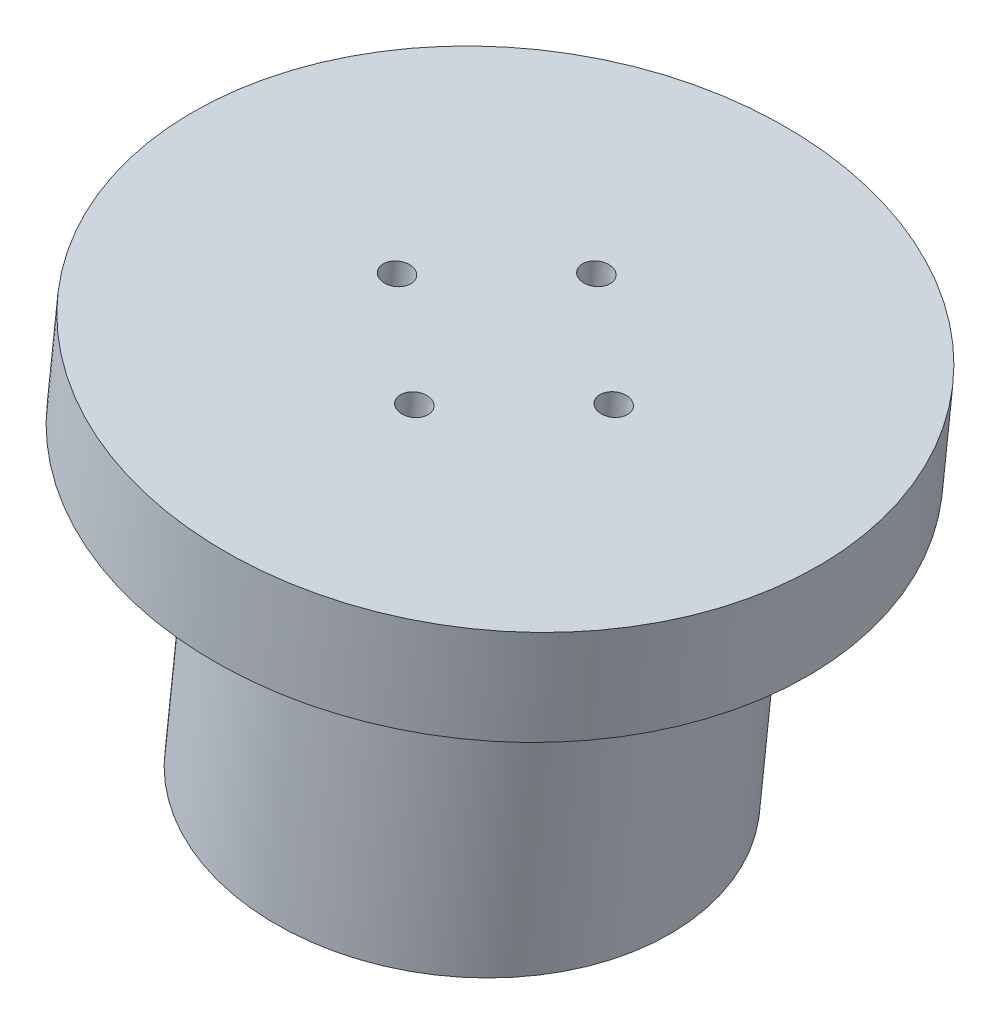
ISO-10303-21;
HEADER;
FILE_DESCRIPTION(('STEP AP214'),'2;1');
FILE_NAME('part.step','',(''),(''),'','','');
FILE_SCHEMA(('AUTOMOTIVE_DESIGN { 1 0 10303 214 1 1 1 1 }'));
ENDSEC;
DATA;
#1=APPLICATION_CONTEXT('core data for automotive mechanical design processes');
#2=APPLICATION_PROTOCOL_DEFINITION('international standard','automotive_design',2000,#1);
#3=PRODUCT_CONTEXT('',#1,'mechanical');
#4=PRODUCT('Part','Part','',(#3));
#5=PRODUCT_RELATED_PRODUCT_CATEGORY('part','',(#4));
#6=PRODUCT_DEFINITION_FORMATION('','',#4);
#7=PRODUCT_DEFINITION_CONTEXT('part definition',#1,'design');
#8=PRODUCT_DEFINITION('design','',#6,#7);
#9=PRODUCT_DEFINITION_SHAPE('','',#8);
#10=(LENGTH_UNIT() NAMED_UNIT(*) SI_UNIT(.MILLI.,.METRE.));
#11=(NAMED_UNIT(*) PLANE_ANGLE_UNIT() SI_UNIT($,.RADIAN.));
#12=(NAMED_UNIT(*) SI_UNIT($,.STERADIAN.) SOLID_ANGLE_UNIT());
#13=UNCERTAINTY_MEASURE_WITH_UNIT(LENGTH_MEASURE(1.E-05),#10,'distance_accuracy_value','');
#14=(GEOMETRIC_REPRESENTATION_CONTEXT(3) GLOBAL_UNCERTAINTY_ASSIGNED_CONTEXT((#13)) GLOBAL_UNIT_ASSIGNED_CONTEXT((#10,
#11,#12)) REPRESENTATION_CONTEXT('',''));
#15=CARTESIAN_POINT('',(0.,0.,0.));
#16=DIRECTION('',(0.,0.,1.));
#17=DIRECTION('',(1.,0.,0.));
#18=AXIS2_PLACEMENT_3D('',#15,#16,#17);
#19=CARTESIAN_POINT('',(7.83250383480386,445.546548210172,8.65719315332694));
#20=DIRECTION('',(0.116648657415178,0.993096529839059,0.0123439517519945));
#21=DIRECTION('',(0.133769325424471,-0.0280256039483678,0.99061613811749));
#22=AXIS2_PLACEMENT_3D('',#19,#20,#21);
#23=PLANE('',#22);
#24=CARTESIAN_POINT('',(11.4562528553722,444.746221265878,38.8012232444906));
#25=DIRECTION('',(0.116648657415178,0.993096529839059,0.0123439517519945));
#26=DIRECTION('',(-0.99317219910734,0.116657545492306,0.));
#27=AXIS2_PLACEMENT_3D('',#24,#25,#26);
#28=CIRCLE('',#27,1.36499999999957);
#29=CARTESIAN_POINT('',(10.1005728035911,444.905458815475,38.8012232444905));
#30=VERTEX_POINT('',#29);
#31=EDGE_CURVE('E142',#30,#30,#28,.F.);
#32=ORIENTED_EDGE('',*,*,#31,.F.);
#33=EDGE_LOOP('',(#32));
#34=FACE_BOUND('',#33,.T.);
#35=CARTESIAN_POINT('',(0.914724071024655,446.094423300402,29.9515789486514));
#36=DIRECTION('',(0.116648657415178,0.993096529839059,0.0123439517519945));
#37=DIRECTION('',(-0.99317219910734,0.116657545492306,0.));
#38=AXIS2_PLACEMENT_3D('',#35,#36,#37);
#39=CIRCLE('',#38,1.36499999999956);
#40=CARTESIAN_POINT('',(-0.440955980756431,446.253660849999,29.9515789486514));
#41=VERTEX_POINT('',#40);
#42=EDGE_CURVE('E150',#41,#41,#39,.F.);
#43=ORIENTED_EDGE('',*,*,#42,.F.);
#44=EDGE_LOOP('',(#43));
#45=FACE_BOUND('',#44,.T.);
#46=CARTESIAN_POINT('',(9.71991725239853,445.192248297397,19.3255573364657));
#47=DIRECTION('',(0.116648657415178,0.993096529839059,0.0123439517519945));
#48=DIRECTION('',(-0.99317219910734,0.116657545492306,0.));
#49=AXIS2_PLACEMENT_3D('',#46,#47,#48);
#50=CIRCLE('',#49,1.365);
#51=CARTESIAN_POINT('',(8.36423720061702,445.351485846994,19.3255573364657));
#52=VERTEX_POINT('',#51);
#53=EDGE_CURVE('E156',#52,#52,#50,.F.);
#54=ORIENTED_EDGE('',*,*,#53,.F.);
#55=EDGE_LOOP('',(#54));
#56=FACE_BOUND('',#55,.T.);
#57=CARTESIAN_POINT('',(20.2614460367461,443.844046262872,28.1752016323049));
#58=DIRECTION('',(0.116648657415178,0.993096529839059,0.0123439517519945));
#59=DIRECTION('',(-0.99317219910734,0.116657545492306,0.));
#60=AXIS2_PLACEMENT_3D('',#57,#58,#59);
#61=CIRCLE('',#60,1.36499999999999);
#62=CARTESIAN_POINT('',(18.9057659849646,444.00328381247,28.1752016323048));
#63=VERTEX_POINT('',#62);
#64=EDGE_CURVE('E162',#63,#63,#61,.F.);
#65=ORIENTED_EDGE('',*,*,#64,.F.);
#66=EDGE_LOOP('',(#65));
#67=FACE_BOUND('',#66,.T.);
#68=CARTESIAN_POINT('',(10.5880850538852,444.969234781637,29.0633902904782));
#69=DIRECTION('',(0.116648657415178,0.993096529839059,0.0123439517519945));
#70=DIRECTION('',(-0.99317219910734,0.116657545492306,0.));
#71=AXIS2_PLACEMENT_3D('',#68,#69,#70);
#72=CIRCLE('',#71,20.5994999988178);
#73=CARTESIAN_POINT('',(-9.87076566045233,447.372321889868,29.0633902904782));
#74=VERTEX_POINT('',#73);
#75=EDGE_CURVE('E11',#74,#74,#72,.T.);
#76=ORIENTED_EDGE('',*,*,#75,.F.);
#77=EDGE_LOOP('',(#76));
#78=FACE_BOUND('',#77,.T.);
#79=DIRECTION('',(-0.762244246598037,0.0974867369922966,-0.639906278011698));
#80=VECTOR('',#79,1.);
#81=CARTESIAN_POINT('',(13.4438543253917,444.644483562369,28.203670270111));
#82=LINE('',#81,#80);
#83=CARTESIAN_POINT('',(13.4438543253449,444.644483562333,28.2036702701231));
#84=VERTEX_POINT('',#83);
#85=CARTESIAN_POINT('',(10.9157761608135,444.967810491008,26.0813412449968));
#86=VERTEX_POINT('',#85);
#87=EDGE_CURVE('E54',#84,#86,#82,.T.);
#88=ORIENTED_EDGE('',*,*,#87,.T.);
#89=CARTESIAN_POINT('',(10.5880850538712,444.969234781684,29.0633902904626));
#90=DIRECTION('',(-0.116648657417233,-0.993096529838796,-0.01234395175372));
#91=DIRECTION('',(0.993172199107099,-0.116657545494363,0.));
#92=AXIS2_PLACEMENT_3D('',#89,#90,#91);
#93=CIRCLE('',#92,2.99999999995608);
#94=EDGE_CURVE('E73',#84,#86,#93,.T.);
#95=ORIENTED_EDGE('',*,*,#94,.F.);
#96=EDGE_LOOP('',(#88,#95));
#97=FACE_BOUND('',#96,.T.);
#98=ADVANCED_FACE('F39',(#34,#45,#56,#67,#78,#97),#23,.F.);
#99=CARTESIAN_POINT('',(3.79164615028357,387.107275288299,28.3441800073878));
#100=DIRECTION('',(0.116648657417233,0.993096529838796,0.0123439517537201));
#101=DIRECTION('',(-0.993172199107099,0.116657545494364,0.));
#102=AXIS2_PLACEMENT_3D('',#99,#100,#101);
#103=CYLINDRICAL_SURFACE('',#102,20.5994999988178);
#104=ORIENTED_EDGE('',*,*,#75,.T.);
#105=EDGE_LOOP('',(#104));
#106=FACE_BOUND('',#105,.T.);
#107=CARTESIAN_POINT('',(14.1283718064982,475.109714462245,29.4380292262036));
#108=DIRECTION('',(-0.116648657415178,-0.993096529839059,-0.0123439517519948));
#109=DIRECTION('',(0.993172199107341,-0.116657545492306,0.));
#110=AXIS2_PLACEMENT_3D('',#107,#108,#109);
#111=CIRCLE('',#110,20.5994999988178);
#112=CARTESIAN_POINT('',(34.5872225208358,472.706627354014,29.4380292262036));
#113=VERTEX_POINT('',#112);
#114=EDGE_CURVE('E47',#113,#113,#111,.F.);
#115=ORIENTED_EDGE('',*,*,#114,.F.);
#116=EDGE_LOOP('',(#115));
#117=FACE_BOUND('',#116,.T.);
#118=ADVANCED_FACE('F41',(#106,#117),#103,.T.);
#119=CARTESIAN_POINT('',(14.610340899564,454.575448860757,28.3271097876482));
#120=DIRECTION('',(-0.636692075693538,0.0652351019983664,0.768353813172237));
#121=DIRECTION('',(0.769993960276496,0.,0.638051174387852));
#122=AXIS2_PLACEMENT_3D('',#119,#120,#121);
#123=PLANE('',#122);
#124=ORIENTED_EDGE('',*,*,#87,.F.);
#125=DIRECTION('',(-0.116648657417233,-0.993096529838796,-0.01234395175372));
#126=VECTOR('',#125,1.);
#127=CARTESIAN_POINT('',(14.610340899564,454.575448860757,28.3271097876482));
#128=LINE('',#127,#126);
#129=CARTESIAN_POINT('',(14.610340899564,454.575448860757,28.3271097876482));
#130=VERTEX_POINT('',#129);
#131=EDGE_CURVE('E59',#130,#84,#128,.T.);
#132=ORIENTED_EDGE('',*,*,#131,.F.);
#133=DIRECTION('',(-0.762244246598037,0.0974867369922966,-0.639906278011698));
#134=VECTOR('',#133,1.);
#135=CARTESIAN_POINT('',(14.610340899564,454.575448860757,28.3271097876482));
#136=LINE('',#135,#134);
#137=CARTESIAN_POINT('',(12.0822627349859,454.898775789396,26.204780762534));
#138=VERTEX_POINT('',#137);
#139=EDGE_CURVE('E68',#130,#138,#136,.T.);
#140=ORIENTED_EDGE('',*,*,#139,.T.);
#141=DIRECTION('',(-0.116648657417233,-0.993096529838796,-0.01234395175372));
#142=VECTOR('',#141,1.);
#143=CARTESIAN_POINT('',(12.0822627349859,454.898775789396,26.204780762534));
#144=LINE('',#143,#142);
#145=EDGE_CURVE('E65',#138,#86,#144,.T.);
#146=ORIENTED_EDGE('',*,*,#145,.T.);
#147=EDGE_LOOP('',(#124,#132,#140,#146));
#148=FACE_BOUND('',#147,.T.);
#149=ADVANCED_FACE('F67',(#148),#123,.T.);
#150=CARTESIAN_POINT('',(11.7545716280435,454.900200080072,29.1868298079998));
#151=DIRECTION('',(-0.116648657417233,-0.993096529838796,-0.01234395175372));
#152=DIRECTION('',(0.993172199107099,-0.116657545494363,0.));
#153=AXIS2_PLACEMENT_3D('',#150,#151,#152);
#154=CYLINDRICAL_SURFACE('',#153,2.99999999995608);
#155=ORIENTED_EDGE('',*,*,#94,.T.);
#156=ORIENTED_EDGE('',*,*,#145,.F.);
#157=CARTESIAN_POINT('',(11.7545716280435,454.900200080072,29.1868298079998));
#158=DIRECTION('',(-0.116648657417233,-0.993096529838796,-0.01234395175372));
#159=DIRECTION('',(0.993172199107099,-0.116657545494363,0.));
#160=AXIS2_PLACEMENT_3D('',#157,#158,#159);
#161=CIRCLE('',#160,2.99999999995608);
#162=EDGE_CURVE('E78',#130,#138,#161,.T.);
#163=ORIENTED_EDGE('',*,*,#162,.F.);
#164=ORIENTED_EDGE('',*,*,#131,.T.);
#165=EDGE_LOOP('',(#155,#156,#163,#164));
#166=FACE_BOUND('',#165,.T.);
#167=ADVANCED_FACE('F74',(#166),#154,.F.);
#168=CARTESIAN_POINT('',(11.7545716280435,454.900200080072,29.1868298079998));
#169=DIRECTION('',(-0.116648657417233,-0.993096529838796,-0.01234395175372));
#170=DIRECTION('',(0.993172199107099,-0.116657545494363,0.));
#171=AXIS2_PLACEMENT_3D('',#168,#169,#170);
#172=PLANE('',#171);
#173=ORIENTED_EDGE('',*,*,#162,.T.);
#174=ORIENTED_EDGE('',*,*,#139,.F.);
#175=EDGE_LOOP('',(#173,#174));
#176=FACE_BOUND('',#175,.T.);
#177=ADVANCED_FACE('F107',(#176),#172,.T.);
#178=CARTESIAN_POINT('',(15.2948583806147,485.040679760685,29.56146874369));
#179=DIRECTION('',(-0.116648657417232,-0.993096529838796,-0.0123439517537199));
#180=DIRECTION('',(0.993172199107099,-0.116657545494363,0.));
#181=AXIS2_PLACEMENT_3D('',#178,#179,#180);
#182=CYLINDRICAL_SURFACE('',#181,30.9999999992725);
#183=CARTESIAN_POINT('',(15.2948583806147,485.040679760685,29.56146874369));
#184=DIRECTION('',(0.116648657417232,0.993096529838796,0.0123439517537199));
#185=DIRECTION('',(-0.993172199107099,0.116657545494363,0.));
#186=AXIS2_PLACEMENT_3D('',#183,#184,#185);
#187=CIRCLE('',#186,30.9999999992725);
#188=CARTESIAN_POINT('',(46.0831965522122,481.424295850445,29.56146874369));
#189=VERTEX_POINT('',#188);
#190=EDGE_CURVE('E76',#189,#189,#187,.T.);
#191=CARTESIAN_POINT('',(14.1283718064424,475.109714462297,29.4380292261528));
#192=DIRECTION('',(0.116648657417232,0.993096529838796,0.0123439517537199));
#193=DIRECTION('',(-0.993172199107099,0.116657545494363,0.));
#194=AXIS2_PLACEMENT_3D('',#191,#192,#193);
#195=CIRCLE('',#194,30.9999999992725);
#196=CARTESIAN_POINT('',(44.9167099780399,471.493330552057,29.4380292261528));
#197=VERTEX_POINT('',#196);
#198=EDGE_CURVE('E143',#197,#197,#195,.T.);
#199=CARTESIAN_POINT('',(46.0831965522122,481.424295850445,29.56146874369));
#200=CARTESIAN_POINT('',(46.0710456503979,481.320848295253,29.5601829153823));
#201=CARTESIAN_POINT('',(46.0588947485836,481.217400740062,29.5588970870747));
#202=CARTESIAN_POINT('',(46.034592944955,481.010505629679,29.5563254304593));
#203=CARTESIAN_POINT('',(46.0224420431407,480.907058074487,29.5550396021516));
#204=CARTESIAN_POINT('',(45.9981402395122,480.700162964104,29.5524679455363));
#205=CARTESIAN_POINT('',(45.9859893376979,480.596715408913,29.5511821172286));
#206=CARTESIAN_POINT('',(45.9616875340693,480.38982029853,29.5486104606132));
#207=CARTESIAN_POINT('',(45.949536632255,480.286372743338,29.5473246323055));
#208=CARTESIAN_POINT('',(45.9252348286264,480.079477632955,29.5447529756902));
#209=CARTESIAN_POINT('',(45.9130839268121,479.976030077763,29.5434671473825));
#210=CARTESIAN_POINT('',(45.8887821231835,479.76913496738,29.5408954907671));
#211=CARTESIAN_POINT('',(45.8766312213692,479.665687412189,29.5396096624595));
#212=CARTESIAN_POINT('',(45.8523294177406,479.458792301806,29.5370380058441));
#213=CARTESIAN_POINT('',(45.8401785159263,479.355344746614,29.5357521775364));
#214=CARTESIAN_POINT('',(45.8158767122977,479.148449636231,29.5331805209211));
#215=CARTESIAN_POINT('',(45.8037258104834,479.045002081039,29.5318946926134));
#216=CARTESIAN_POINT('',(45.7794240068548,478.838106970656,29.529323035998));
#217=CARTESIAN_POINT('',(45.7672731050405,478.734659415465,29.5280372076904));
#218=CARTESIAN_POINT('',(45.742971301412,478.527764305082,29.525465551075));
#219=CARTESIAN_POINT('',(45.7308203995977,478.42431674989,29.5241797227673));
#220=CARTESIAN_POINT('',(45.7065185959691,478.217421639507,29.521608066152));
#221=CARTESIAN_POINT('',(45.6943676941548,478.113974084316,29.5203222378443));
#222=CARTESIAN_POINT('',(45.6700658905262,477.907078973933,29.5177505812289));
#223=CARTESIAN_POINT('',(45.6579149887119,477.803631418741,29.5164647529212));
#224=CARTESIAN_POINT('',(45.6336131850833,477.596736308358,29.5138930963059));
#225=CARTESIAN_POINT('',(45.621462283269,477.493288753166,29.5126072679982));
#226=CARTESIAN_POINT('',(45.5971604796404,477.286393642783,29.5100356113828));
#227=CARTESIAN_POINT('',(45.5850095778261,477.182946087592,29.5087497830752));
#228=CARTESIAN_POINT('',(45.5607077741975,476.976050977209,29.5061781264598));
#229=CARTESIAN_POINT('',(45.5485568723832,476.872603422017,29.5048922981521));
#230=CARTESIAN_POINT('',(45.5242550687546,476.665708311634,29.5023206415368));
#231=CARTESIAN_POINT('',(45.5121041669403,476.562260756442,29.5010348132291));
#232=CARTESIAN_POINT('',(45.4878023633118,476.355365646059,29.4984631566137));
#233=CARTESIAN_POINT('',(45.4756514614975,476.251918090868,29.4971773283061));
#234=CARTESIAN_POINT('',(45.4513496578689,476.045022980485,29.4946056716907));
#235=CARTESIAN_POINT('',(45.4391987560546,475.941575425293,29.493319843383));
#236=CARTESIAN_POINT('',(45.414896952426,475.73468031491,29.4907481867677));
#237=CARTESIAN_POINT('',(45.4027460506117,475.631232759719,29.48946235846));
#238=CARTESIAN_POINT('',(45.3784442469831,475.424337649336,29.4868907018446));
#239=CARTESIAN_POINT('',(45.3662933451688,475.320890094144,29.4856048735369));
#240=CARTESIAN_POINT('',(45.3419915415402,475.113994983761,29.4830332169216));
#241=CARTESIAN_POINT('',(45.3298406397259,475.010547428569,29.4817473886139));
#242=CARTESIAN_POINT('',(45.3055388360973,474.803652318186,29.4791757319985));
#243=CARTESIAN_POINT('',(45.293387934283,474.700204762995,29.4778899036909));
#244=CARTESIAN_POINT('',(45.2690861306545,474.493309652612,29.4753182470755));
#245=CARTESIAN_POINT('',(45.2569352288402,474.38986209742,29.4740324187678));
#246=CARTESIAN_POINT('',(45.2326334252116,474.182966987037,29.4714607621525));
#247=CARTESIAN_POINT('',(45.2204825233973,474.079519431845,29.4701749338448));
#248=CARTESIAN_POINT('',(45.1961807197687,473.872624321462,29.4676032772294));
#249=CARTESIAN_POINT('',(45.1840298179544,473.769176766271,29.4663174489218));
#250=CARTESIAN_POINT('',(45.1597280143258,473.562281655888,29.4637457923064));
#251=CARTESIAN_POINT('',(45.1475771125115,473.458834100696,29.4624599639987));
#252=CARTESIAN_POINT('',(45.1232753088829,473.251938990313,29.4598883073834));
#253=CARTESIAN_POINT('',(45.1111244070686,473.148491435122,29.4586024790757));
#254=CARTESIAN_POINT('',(45.08682260344,472.941596324739,29.4560308224603));
#255=CARTESIAN_POINT('',(45.0746717016257,472.838148769547,29.4547449941526));
#256=CARTESIAN_POINT('',(45.0503698979971,472.631253659164,29.4521733375373));
#257=CARTESIAN_POINT('',(45.0382189961828,472.527806103972,29.4508875092296));
#258=CARTESIAN_POINT('',(45.0139171925543,472.320910993589,29.4483158526143));
#259=CARTESIAN_POINT('',(45.00176629074,472.217463438398,29.4470300243066));
#260=CARTESIAN_POINT('',(44.9774644871114,472.010568328015,29.4444583676912));
#261=CARTESIAN_POINT('',(44.9653135852971,471.907120772823,29.4431725393835));
#262=CARTESIAN_POINT('',(44.9410117816685,471.70022566244,29.4406008827682));
#263=CARTESIAN_POINT('',(44.9288608798542,471.596778107249,29.4393150544605));
#264=CARTESIAN_POINT('',(44.9167099780399,471.493330552057,29.4380292261528));
#265=B_SPLINE_CURVE_WITH_KNOTS('',3,(#199,#200,#201,#202,#203,#204,#205,#206,#207,#208,#209,
#210,#211,#212,#213,#214,#215,#216,#217,#218,#219,#220,#221,#222,#223,#224,#225,#226,#227,#228,
#229,#230,#231,#232,#233,#234,#235,#236,#237,#238,#239,#240,#241,#242,#243,#244,#245,#246,#247,
#248,#249,#250,#251,#252,#253,#254,#255,#256,#257,#258,#259,#260,#261,#262,#263,#264),
.UNSPECIFIED.,.F.,.F.,(4,2,2,2,2,2,2,2,2,2,2,2,2,2,2,2,2,2,2,2,2,2,2,2,2,2,2,2,2,2,2,2,4),(0.,
0.312499999999991,0.624999999999981,0.937499999999972,1.24999999999996,1.56249999999995,
1.87499999999994,2.18749999999999,2.49999999999998,2.81249999999997,3.12499999999996,
3.43749999999995,3.74999999999994,4.06249999999999,4.37499999999998,4.68749999999997,
4.99999999999996,5.31249999999995,5.62499999999994,5.93749999999993,6.24999999999998,
6.56249999999997,6.87499999999996,7.18749999999995,7.49999999999994,7.81249999999993,
8.12499999999998,8.43749999999997,8.74999999999996,9.06249999999995,9.37499999999994,
9.68749999999993,9.99999999999992),.UNSPECIFIED.);
#266=EDGE_CURVE('BSEAM111',#189,#197,#265,.T.);
#267=ORIENTED_EDGE('',*,*,#190,.F.);
#268=ORIENTED_EDGE('',*,*,#198,.T.);
#269=ORIENTED_EDGE('',*,*,#266,.T.);
#270=ORIENTED_EDGE('',*,*,#266,.F.);
#271=EDGE_LOOP('',(#267,#269,#268,#270));
#272=FACE_BOUND('',#271,.T.);
#273=ADVANCED_FACE('F111',(#272),#182,.T.);
#274=CARTESIAN_POINT('',(15.2948583806147,485.040679760685,29.56146874369));
#275=DIRECTION('',(0.116648657417232,0.993096529838796,0.0123439517537199));
#276=DIRECTION('',(-0.993172199107099,0.116657545494363,0.));
#277=AXIS2_PLACEMENT_3D('',#274,#275,#276);
#278=PLANE('',#277);
#279=CARTESIAN_POINT('',(16.1630261821607,484.8176662449,39.2993016977535));
#280=DIRECTION('',(0.116648657417232,0.993096529838796,0.0123439517537199));
#281=DIRECTION('',(-0.993172199107099,0.116657545494363,0.));
#282=AXIS2_PLACEMENT_3D('',#279,#280,#281);
#283=CIRCLE('',#282,1.36499999999957);
#284=CARTESIAN_POINT('',(14.8073461303799,484.9769037945,39.2993016977535));
#285=VERTEX_POINT('',#284);
#286=EDGE_CURVE('E140',#285,#285,#283,.T.);
#287=ORIENTED_EDGE('',*,*,#286,.F.);
#288=EDGE_LOOP('',(#287));
#289=FACE_BOUND('',#288,.T.);
#290=CARTESIAN_POINT('',(5.62149739781746,486.165868279461,30.4496574019148));
#291=DIRECTION('',(0.116648657417232,0.993096529838796,0.0123439517537199));
#292=DIRECTION('',(-0.993172199107099,0.116657545494363,0.));
#293=AXIS2_PLACEMENT_3D('',#290,#291,#292);
#294=CIRCLE('',#293,1.36499999999956);
#295=CARTESIAN_POINT('',(4.26581734603671,486.325105829061,30.4496574019148));
#296=VERTEX_POINT('',#295);
#297=EDGE_CURVE('E147',#296,#296,#294,.T.);
#298=ORIENTED_EDGE('',*,*,#297,.F.);
#299=EDGE_LOOP('',(#298));
#300=FACE_BOUND('',#299,.T.);
#301=CARTESIAN_POINT('',(14.4266905791913,485.263693276456,19.8236357897291));
#302=DIRECTION('',(0.116648657417232,0.993096529838796,0.0123439517537199));
#303=DIRECTION('',(-0.993172199107099,0.116657545494363,0.));
#304=AXIS2_PLACEMENT_3D('',#301,#302,#303);
#305=CIRCLE('',#304,1.365);
#306=CARTESIAN_POINT('',(13.0710105274102,485.422930826055,19.8236357897291));
#307=VERTEX_POINT('',#306);
#308=EDGE_CURVE('E153',#307,#307,#305,.T.);
#309=ORIENTED_EDGE('',*,*,#308,.F.);
#310=EDGE_LOOP('',(#309));
#311=FACE_BOUND('',#310,.T.);
#312=CARTESIAN_POINT('',(24.9682193635346,483.915491241895,28.6732800855678));
#313=DIRECTION('',(0.116648657417232,0.993096529838796,0.0123439517537199));
#314=DIRECTION('',(-0.993172199107099,0.116657545494363,0.));
#315=AXIS2_PLACEMENT_3D('',#312,#313,#314);
#316=CIRCLE('',#315,1.36499999999999);
#317=CARTESIAN_POINT('',(23.6125393117534,484.074728791494,28.6732800855678));
#318=VERTEX_POINT('',#317);
#319=EDGE_CURVE('E159',#318,#318,#316,.T.);
#320=ORIENTED_EDGE('',*,*,#319,.F.);
#321=EDGE_LOOP('',(#320));
#322=FACE_BOUND('',#321,.T.);
#323=ORIENTED_EDGE('',*,*,#190,.T.);
#324=EDGE_LOOP('',(#323));
#325=FACE_BOUND('',#324,.T.);
#326=ADVANCED_FACE('F115',(#289,#300,#311,#322,#325),#278,.T.);
#327=CARTESIAN_POINT('',(14.1283718064424,475.109714462297,29.4380292261528));
#328=DIRECTION('',(0.116648657417232,0.993096529838796,0.0123439517537199));
#329=DIRECTION('',(-0.993172199107099,0.116657545494363,0.));
#330=AXIS2_PLACEMENT_3D('',#327,#328,#329);
#331=PLANE('',#330);
#332=ORIENTED_EDGE('',*,*,#114,.T.);
#333=EDGE_LOOP('',(#332));
#334=FACE_BOUND('',#333,.T.);
#335=ORIENTED_EDGE('',*,*,#198,.F.);
#336=EDGE_LOOP('',(#335));
#337=FACE_BOUND('',#336,.T.);
#338=ADVANCED_FACE('F86',(#334,#337),#331,.F.);
#339=CARTESIAN_POINT('',(19.5665439729466,437.927948783339,28.1016659591216));
#340=DIRECTION('',(0.116648657417232,0.993096529838796,0.0123439517537199));
#341=DIRECTION('',(-0.993172199107099,0.116657545494363,0.));
#342=AXIS2_PLACEMENT_3D('',#339,#340,#341);
#343=CYLINDRICAL_SURFACE('',#342,1.36499999999999);
#344=CARTESIAN_POINT('',(23.6125393117534,484.074728791494,28.6732800855678));
#345=CARTESIAN_POINT('',(23.5635104229327,483.657317906296,28.6680917683463));
#346=CARTESIAN_POINT('',(23.514481534112,483.239907021098,28.6629034511248));
#347=CARTESIAN_POINT('',(23.4164237564705,482.405085250702,28.6525268166818));
#348=CARTESIAN_POINT('',(23.3673948676498,481.987674365503,28.6473384994603));
#349=CARTESIAN_POINT('',(23.2693370900084,481.152852595107,28.6369618650174));
#350=CARTESIAN_POINT('',(23.2203082011877,480.735441709909,28.6317735477959));
#351=CARTESIAN_POINT('',(23.1222504235462,479.900619939513,28.6213969133529));
#352=CARTESIAN_POINT('',(23.0732215347255,479.483209054314,28.6162085961314));
#353=CARTESIAN_POINT('',(22.9751637570841,478.648387283918,28.6058319616884));
#354=CARTESIAN_POINT('',(22.9261348682634,478.23097639872,28.6006436444669));
#355=CARTESIAN_POINT('',(22.8280770906219,477.396154628324,28.590267010024));
#356=CARTESIAN_POINT('',(22.7790482018012,476.978743743125,28.5850786928025));
#357=CARTESIAN_POINT('',(22.6809904241598,476.143921972729,28.5747020583595));
#358=CARTESIAN_POINT('',(22.6319615353391,475.726511087531,28.569513741138));
#359=CARTESIAN_POINT('',(22.5339037576976,474.891689317134,28.559137106695));
#360=CARTESIAN_POINT('',(22.4848748688769,474.474278431936,28.5539487894735));
#361=CARTESIAN_POINT('',(22.3868170912355,473.63945666154,28.5435721550306));
#362=CARTESIAN_POINT('',(22.3377882024148,473.222045776342,28.5383838378091));
#363=CARTESIAN_POINT('',(22.2397304247733,472.387224005945,28.5280072033661));
#364=CARTESIAN_POINT('',(22.1907015359526,471.969813120747,28.5228188861446));
#365=CARTESIAN_POINT('',(22.0926437583112,471.134991350351,28.5124422517016));
#366=CARTESIAN_POINT('',(22.0436148694905,470.717580465153,28.5072539344801));
#367=CARTESIAN_POINT('',(21.945557091849,469.882758694756,28.4968773000372));
#368=CARTESIAN_POINT('',(21.8965282030283,469.465347809558,28.4916889828157));
#369=CARTESIAN_POINT('',(21.7984704253869,468.630526039162,28.4813123483727));
#370=CARTESIAN_POINT('',(21.7494415365662,468.213115153964,28.4761240311512));
#371=CARTESIAN_POINT('',(21.6513837589247,467.378293383567,28.4657473967082));
#372=CARTESIAN_POINT('',(21.602354870104,466.960882498369,28.4605590794867));
#373=CARTESIAN_POINT('',(21.5042970924626,466.126060727973,28.4501824450438));
#374=CARTESIAN_POINT('',(21.4552682036419,465.708649842775,28.4449941278223));
#375=CARTESIAN_POINT('',(21.3572104260004,464.873828072378,28.4346174933793));
#376=CARTESIAN_POINT('',(21.3081815371797,464.45641718718,28.4294291761578));
#377=CARTESIAN_POINT('',(21.2101237595383,463.621595416784,28.4190525417148));
#378=CARTESIAN_POINT('',(21.1610948707176,463.204184531586,28.4138642244933));
#379=CARTESIAN_POINT('',(21.0630370930761,462.369362761189,28.4034875900504));
#380=CARTESIAN_POINT('',(21.0140082042554,461.951951875991,28.3982992728289));
#381=CARTESIAN_POINT('',(20.915950426614,461.117130105595,28.3879226383859));
#382=CARTESIAN_POINT('',(20.8669215377933,460.699719220397,28.3827343211644));
#383=CARTESIAN_POINT('',(20.7688637601519,459.86489745,28.3723576867214));
#384=CARTESIAN_POINT('',(20.7198348713311,459.447486564802,28.3671693694999));
#385=CARTESIAN_POINT('',(20.6217770936897,458.612664794406,28.356792735057));
#386=CARTESIAN_POINT('',(20.572748204869,458.195253909207,28.3516044178355));
#387=CARTESIAN_POINT('',(20.4746904272276,457.360432138811,28.3412277833925));
#388=CARTESIAN_POINT('',(20.4256615384068,456.943021253613,28.336039466171));
#389=CARTESIAN_POINT('',(20.3276037607654,456.108199483217,28.325662831728));
#390=CARTESIAN_POINT('',(20.2785748719447,455.690788598018,28.3204745145065));
#391=CARTESIAN_POINT('',(20.1805170943033,454.855966827622,28.3100978800636));
#392=CARTESIAN_POINT('',(20.1314882054825,454.438555942424,28.3049095628421));
#393=CARTESIAN_POINT('',(20.0334304278411,453.603734172028,28.2945329283991));
#394=CARTESIAN_POINT('',(19.9844015390204,453.186323286829,28.2893446111776));
#395=CARTESIAN_POINT('',(19.8863437613789,452.351501516433,28.2789679767346));
#396=CARTESIAN_POINT('',(19.8373148725582,451.934090631235,28.2737796595131));
#397=CARTESIAN_POINT('',(19.7392570949168,451.099268860838,28.2634030250702));
#398=CARTESIAN_POINT('',(19.6902282060961,450.68185797564,28.2582147078487));
#399=CARTESIAN_POINT('',(19.5921704284547,449.847036205244,28.2478380734057));
#400=CARTESIAN_POINT('',(19.5431415396339,449.429625320046,28.2426497561842));
#401=CARTESIAN_POINT('',(19.4450837619925,448.594803549649,28.2322731217412));
#402=CARTESIAN_POINT('',(19.3960548731718,448.177392664451,28.2270848045197));
#403=CARTESIAN_POINT('',(19.2979970955304,447.342570894055,28.2167081700767));
#404=CARTESIAN_POINT('',(19.2489682067096,446.925160008857,28.2115198528553));
#405=CARTESIAN_POINT('',(19.1509104290682,446.09033823846,28.2011432184123));
#406=CARTESIAN_POINT('',(19.1018815402475,445.672927353262,28.1959549011908));
#407=CARTESIAN_POINT('',(19.0038237626061,444.838105582866,28.1855782667478));
#408=CARTESIAN_POINT('',(18.9547948737853,444.420694697668,28.1803899495263));
#409=CARTESIAN_POINT('',(18.9057659849646,444.00328381247,28.1752016323048));
#410=B_SPLINE_CURVE_WITH_KNOTS('',3,(#344,#345,#346,#347,#348,#349,#350,#351,#352,#353,#354,
#355,#356,#357,#358,#359,#360,#361,#362,#363,#364,#365,#366,#367,#368,#369,#370,#371,#372,#373,
#374,#375,#376,#377,#378,#379,#380,#381,#382,#383,#384,#385,#386,#387,#388,#389,#390,#391,#392,
#393,#394,#395,#396,#397,#398,#399,#400,#401,#402,#403,#404,#405,#406,#407,#408,#409),
.UNSPECIFIED.,.F.,.F.,(4,2,2,2,2,2,2,2,2,2,2,2,2,2,2,2,2,2,2,2,2,2,2,2,2,2,2,2,2,2,2,2,4),(0.,
1.26093750000089,2.52187500000183,3.78281250000277,5.04375000000366,6.3046875000046,
7.56562500000554,8.82656250000648,10.0875000000074,11.3484375000083,12.6093750000093,
13.8703125000101,15.1312500000111,16.392187500012,17.653125000013,18.9140625000139,
20.1750000000148,21.4359375000157,22.6968750000166,23.9578125000176,25.2187500000185,
26.4796875000195,27.7406250000204,29.0015625000213,30.2625000000222,31.5234375000231,
32.7843750000241,34.045312500025,35.3062500000259,36.5671875000268,37.8281250000278,
39.0890625000287,40.3500000000296),.UNSPECIFIED.);
#411=EDGE_CURVE('BSEAM118',#318,#63,#410,.T.);
#412=ORIENTED_EDGE('',*,*,#319,.T.);
#413=ORIENTED_EDGE('',*,*,#64,.T.);
#414=ORIENTED_EDGE('',*,*,#411,.T.);
#415=ORIENTED_EDGE('',*,*,#411,.F.);
#416=EDGE_LOOP('',(#412,#414,#413,#415));
#417=FACE_BOUND('',#416,.T.);
#418=ADVANCED_FACE('F118',(#417),#343,.F.);
#419=CARTESIAN_POINT('',(9.02501518860339,439.2761508179,19.2520216632829));
#420=DIRECTION('',(0.116648657417232,0.993096529838796,0.0123439517537199));
#421=DIRECTION('',(-0.993172199107099,0.116657545494363,0.));
#422=AXIS2_PLACEMENT_3D('',#419,#420,#421);
#423=CYLINDRICAL_SURFACE('',#422,1.365);
#424=CARTESIAN_POINT('',(13.0710105274102,485.422930826055,19.8236357897291));
#425=CARTESIAN_POINT('',(13.0219816385894,485.005519940857,19.8184474725076));
#426=CARTESIAN_POINT('',(12.9729527497686,484.588109055658,19.8132591552861));
#427=CARTESIAN_POINT('',(12.8748949721271,483.753287285261,19.8028825208431));
#428=CARTESIAN_POINT('',(12.8258660833063,483.335876400063,19.7976942036216));
#429=CARTESIAN_POINT('',(12.7278083056648,482.501054629665,19.7873175691787));
#430=CARTESIAN_POINT('',(12.6787794168441,482.083643744467,19.7821292519572));
#431=CARTESIAN_POINT('',(12.5807216392025,481.24882197407,19.7717526175142));
#432=CARTESIAN_POINT('',(12.5316927503818,480.831411088871,19.7665643002927));
#433=CARTESIAN_POINT('',(12.4336349727403,479.996589318474,19.7561876658497));
#434=CARTESIAN_POINT('',(12.3846060839195,479.579178433276,19.7509993486282));
#435=CARTESIAN_POINT('',(12.286548306278,478.744356662878,19.7406227141852));
#436=CARTESIAN_POINT('',(12.2375194174572,478.32694577768,19.7354343969637));
#437=CARTESIAN_POINT('',(12.1394616398157,477.492124007283,19.7250577625207));
#438=CARTESIAN_POINT('',(12.0904327509949,477.074713122084,19.7198694452992));
#439=CARTESIAN_POINT('',(11.9923749733534,476.239891351687,19.7094928108562));
#440=CARTESIAN_POINT('',(11.9433460845326,475.822480466489,19.7043044936348));
#441=CARTESIAN_POINT('',(11.8452883068911,474.987658696091,19.6939278591918));
#442=CARTESIAN_POINT('',(11.7962594180703,474.570247810893,19.6887395419703));
#443=CARTESIAN_POINT('',(11.6982016404288,473.735426040496,19.6783629075273));
#444=CARTESIAN_POINT('',(11.6491727516081,473.318015155297,19.6731745903058));
#445=CARTESIAN_POINT('',(11.5511149739665,472.4831933849,19.6627979558628));
#446=CARTESIAN_POINT('',(11.5020860851458,472.065782499701,19.6576096386413));
#447=CARTESIAN_POINT('',(11.4040283075043,471.230960729304,19.6472330041983));
#448=CARTESIAN_POINT('',(11.3549994186835,470.813549844106,19.6420446869768));
#449=CARTESIAN_POINT('',(11.256941641042,469.978728073709,19.6316680525338));
#450=CARTESIAN_POINT('',(11.2079127522212,469.56131718851,19.6264797353123));
#451=CARTESIAN_POINT('',(11.1098549745797,468.726495418113,19.6161031008694));
#452=CARTESIAN_POINT('',(11.0608260857589,468.309084532914,19.6109147836479));
#453=CARTESIAN_POINT('',(10.9627683081174,467.474262762517,19.6005381492049));
#454=CARTESIAN_POINT('',(10.9137394192966,467.056851877319,19.5953498319834));
#455=CARTESIAN_POINT('',(10.8156816416551,466.222030106922,19.5849731975404));
#456=CARTESIAN_POINT('',(10.7666527528344,465.804619221723,19.5797848803189));
#457=CARTESIAN_POINT('',(10.6685949751928,464.969797451326,19.5694082458759));
#458=CARTESIAN_POINT('',(10.6195660863721,464.552386566127,19.5642199286544));
#459=CARTESIAN_POINT('',(10.5215083087305,463.71756479573,19.5538432942114));
#460=CARTESIAN_POINT('',(10.4724794199098,463.300153910532,19.5486549769899));
#461=CARTESIAN_POINT('',(10.3744216422683,462.465332140135,19.5382783425469));
#462=CARTESIAN_POINT('',(10.3253927534475,462.047921254936,19.5330900253255));
#463=CARTESIAN_POINT('',(10.227334975806,461.213099484539,19.5227133908825));
#464=CARTESIAN_POINT('',(10.1783060869852,460.79568859934,19.517525073661));
#465=CARTESIAN_POINT('',(10.0802483093437,459.960866828943,19.507148439218));
#466=CARTESIAN_POINT('',(10.0312194205229,459.543455943745,19.5019601219965));
#467=CARTESIAN_POINT('',(9.9331616428814,458.708634173347,19.4915834875535));
#468=CARTESIAN_POINT('',(9.88413275406064,458.291223288149,19.486395170332));
#469=CARTESIAN_POINT('',(9.78607497641911,457.456401517752,19.476018535889));
#470=CARTESIAN_POINT('',(9.73704608759835,457.038990632553,19.4708302186675));
#471=CARTESIAN_POINT('',(9.63898830995683,456.204168862156,19.4604535842245));
#472=CARTESIAN_POINT('',(9.58995942113607,455.786757976958,19.455265267003));
#473=CARTESIAN_POINT('',(9.49190164349454,454.95193620656,19.4448886325601));
#474=CARTESIAN_POINT('',(9.44287275467378,454.534525321362,19.4397003153386));
#475=CARTESIAN_POINT('',(9.34481497703226,453.699703550965,19.4293236808956));
#476=CARTESIAN_POINT('',(9.29578608821149,453.282292665766,19.4241353636741));
#477=CARTESIAN_POINT('',(9.19772831056997,452.447470895369,19.4137587292311));
#478=CARTESIAN_POINT('',(9.14869942174921,452.03006001017,19.4085704120096));
#479=CARTESIAN_POINT('',(9.05064164410769,451.195238239773,19.3981937775666));
#480=CARTESIAN_POINT('',(9.00161275528692,450.777827354575,19.3930054603451));
#481=CARTESIAN_POINT('',(8.9035549776454,449.943005584178,19.3826288259021));
#482=CARTESIAN_POINT('',(8.85452608882464,449.525594698979,19.3774405086806));
#483=CARTESIAN_POINT('',(8.75646831118311,448.690772928582,19.3670638742376));
#484=CARTESIAN_POINT('',(8.70743942236235,448.273362043383,19.3618755570161));
#485=CARTESIAN_POINT('',(8.60938164472083,447.438540272986,19.3514989225732));
#486=CARTESIAN_POINT('',(8.56035275590007,447.021129387788,19.3463106053517));
#487=CARTESIAN_POINT('',(8.46229497825855,446.186307617391,19.3359339709087));
#488=CARTESIAN_POINT('',(8.41326608943778,445.768896732192,19.3307456536872));
#489=CARTESIAN_POINT('',(8.36423720061702,445.351485846994,19.3255573364657));
#490=B_SPLINE_CURVE_WITH_KNOTS('',3,(#424,#425,#426,#427,#428,#429,#430,#431,#432,#433,#434,
#435,#436,#437,#438,#439,#440,#441,#442,#443,#444,#445,#446,#447,#448,#449,#450,#451,#452,#453,
#454,#455,#456,#457,#458,#459,#460,#461,#462,#463,#464,#465,#466,#467,#468,#469,#470,#471,#472,
#473,#474,#475,#476,#477,#478,#479,#480,#481,#482,#483,#484,#485,#486,#487,#488,#489),
.UNSPECIFIED.,.F.,.F.,(4,2,2,2,2,2,2,2,2,2,2,2,2,2,2,2,2,2,2,2,2,2,2,2,2,2,2,2,2,2,2,2,4),(0.,
1.26093750000212,2.52187500000418,3.78281250000629,5.04375000000841,6.30468750001047,
7.56562500001258,8.82656250001465,10.0875000000168,11.3484375000188,12.6093750000209,
13.870312500023,15.1312500000251,16.3921875000272,17.6531250000293,18.9140625000314,
20.1750000000335,21.4359375000356,22.6968750000377,23.9578125000398,25.2187500000419,
26.4796875000439,27.7406250000461,29.0015625000481,30.2625000000502,31.5234375000523,
32.7843750000544,34.0453125000565,35.3062500000586,36.5671875000607,37.8281250000627,
39.0890625000649,40.3500000000669),.UNSPECIFIED.);
#491=EDGE_CURVE('BSEAM123',#307,#52,#490,.T.);
#492=ORIENTED_EDGE('',*,*,#308,.T.);
#493=ORIENTED_EDGE('',*,*,#53,.T.);
#494=ORIENTED_EDGE('',*,*,#491,.T.);
#495=ORIENTED_EDGE('',*,*,#491,.F.);
#496=EDGE_LOOP('',(#492,#494,#493,#495));
#497=FACE_BOUND('',#496,.T.);
#498=ADVANCED_FACE('F123',(#497),#423,.F.);
#499=CARTESIAN_POINT('',(0.219822007229517,440.178325820905,29.8780432754686));
#500=DIRECTION('',(0.116648657417232,0.993096529838796,0.0123439517537199));
#501=DIRECTION('',(-0.993172199107099,0.116657545494363,0.));
#502=AXIS2_PLACEMENT_3D('',#499,#500,#501);
#503=CYLINDRICAL_SURFACE('',#502,1.36499999999956);
#504=CARTESIAN_POINT('',(4.26581734603671,486.325105829061,30.4496574019148));
#505=CARTESIAN_POINT('',(4.21678845721595,485.907694943862,30.4444690846933));
#506=CARTESIAN_POINT('',(4.16775956839519,485.490284058663,30.4392807674718));
#507=CARTESIAN_POINT('',(4.06970179075367,484.655462288266,30.4289041330288));
#508=CARTESIAN_POINT('',(4.0206729019329,484.238051403068,30.4237158158073));
#509=CARTESIAN_POINT('',(3.92261512429138,483.403229632671,30.4133391813643));
#510=CARTESIAN_POINT('',(3.87358623547061,482.985818747472,30.4081508641429));
#511=CARTESIAN_POINT('',(3.77552845782909,482.150996977075,30.3977742296999));
#512=CARTESIAN_POINT('',(3.72649956900833,481.733586091876,30.3925859124784));
#513=CARTESIAN_POINT('',(3.62844179136681,480.898764321479,30.3822092780354));
#514=CARTESIAN_POINT('',(3.57941290254604,480.481353436281,30.3770209608139));
#515=CARTESIAN_POINT('',(3.48135512490452,479.646531665884,30.3666443263709));
#516=CARTESIAN_POINT('',(3.43232623608376,479.229120780685,30.3614560091494));
#517=CARTESIAN_POINT('',(3.33426845844224,478.394299010288,30.3510793747064));
#518=CARTESIAN_POINT('',(3.28523956962148,477.976888125089,30.3458910574849));
#519=CARTESIAN_POINT('',(3.18718179197995,477.142066354692,30.3355144230419));
#520=CARTESIAN_POINT('',(3.13815290315919,476.724655469494,30.3303261058204));
#521=CARTESIAN_POINT('',(3.04009512551766,475.889833699097,30.3199494713775));
#522=CARTESIAN_POINT('',(2.9910662366969,475.472422813898,30.314761154156));
#523=CARTESIAN_POINT('',(2.89300845905538,474.637601043501,30.304384519713));
#524=CARTESIAN_POINT('',(2.84397957023462,474.220190158302,30.2991962024915));
#525=CARTESIAN_POINT('',(2.74592179259309,473.385368387905,30.2888195680485));
#526=CARTESIAN_POINT('',(2.69689290377233,472.967957502707,30.283631250827));
#527=CARTESIAN_POINT('',(2.59883512613081,472.133135732309,30.273254616384));
#528=CARTESIAN_POINT('',(2.54980623731005,471.715724847111,30.2680662991625));
#529=CARTESIAN_POINT('',(2.45174845966852,470.880903076714,30.2576896647195));
#530=CARTESIAN_POINT('',(2.40271957084776,470.463492191515,30.252501347498));
#531=CARTESIAN_POINT('',(2.30466179320623,469.628670421118,30.242124713055));
#532=CARTESIAN_POINT('',(2.25563290438547,469.21125953592,30.2369363958336));
#533=CARTESIAN_POINT('',(2.15757512674395,468.376437765522,30.2265597613906));
#534=CARTESIAN_POINT('',(2.10854623792319,467.959026880324,30.2213714441691));
#535=CARTESIAN_POINT('',(2.01048846028166,467.124205109927,30.2109948097261));
#536=CARTESIAN_POINT('',(1.9614595714609,466.706794224728,30.2058064925046));
#537=CARTESIAN_POINT('',(1.86340179381938,465.871972454331,30.1954298580616));
#538=CARTESIAN_POINT('',(1.81437290499862,465.454561569133,30.1902415408401));
#539=CARTESIAN_POINT('',(1.71631512735709,464.619739798735,30.1798649063971));
#540=CARTESIAN_POINT('',(1.66728623853633,464.202328913537,30.1746765891756));
#541=CARTESIAN_POINT('',(1.56922846089481,463.36750714314,30.1642999547326));
#542=CARTESIAN_POINT('',(1.52019957207405,462.950096257941,30.1591116375111));
#543=CARTESIAN_POINT('',(1.42214179443252,462.115274487544,30.1487350030682));
#544=CARTESIAN_POINT('',(1.37311290561176,461.697863602345,30.1435466858467));
#545=CARTESIAN_POINT('',(1.27505512797023,460.863041831948,30.1331700514037));
#546=CARTESIAN_POINT('',(1.22602623914947,460.44563094675,30.1279817341822));
#547=CARTESIAN_POINT('',(1.12796846150795,459.610809176353,30.1176050997392));
#548=CARTESIAN_POINT('',(1.07893957268719,459.193398291154,30.1124167825177));
#549=CARTESIAN_POINT('',(0.980881795045665,458.358576520757,30.1020401480747));
#550=CARTESIAN_POINT('',(0.931852906224901,457.941165635558,30.0968518308532));
#551=CARTESIAN_POINT('',(0.833795128583377,457.106343865161,30.0864751964102));
#552=CARTESIAN_POINT('',(0.784766239762618,456.688932979963,30.0812868791887));
#553=CARTESIAN_POINT('',(0.686708462121094,455.854111209566,30.0709102447457));
#554=CARTESIAN_POINT('',(0.63767957330033,455.436700324367,30.0657219275242));
#555=CARTESIAN_POINT('',(0.539621795658806,454.60187855397,30.0553452930813));
#556=CARTESIAN_POINT('',(0.490592906838046,454.184467668771,30.0501569758598));
#557=CARTESIAN_POINT('',(0.392535129196523,453.349645898374,30.0397803414168));
#558=CARTESIAN_POINT('',(0.343506240375759,452.932235013176,30.0345920241953));
#559=CARTESIAN_POINT('',(0.245448462734235,452.097413242779,30.0242153897523));
#560=CARTESIAN_POINT('',(0.196419573913474,451.68000235758,30.0190270725308));
#561=CARTESIAN_POINT('',(0.0983617962719514,450.845180587183,30.0086504380878));
#562=CARTESIAN_POINT('',(0.0493329074511904,450.427769701984,30.0034621208663));
#563=CARTESIAN_POINT('',(-0.0487248701903345,449.592947931587,29.9930854864233));
#564=CARTESIAN_POINT('',(-0.0977537590110984,449.175537046389,29.9878971692018));
#565=CARTESIAN_POINT('',(-0.195811536652623,448.340715275991,29.9775205347588));
#566=CARTESIAN_POINT('',(-0.244840425473383,447.923304390793,29.9723322175374));
#567=CARTESIAN_POINT('',(-0.342898203114905,447.088482620396,29.9619555830944));
#568=CARTESIAN_POINT('',(-0.391927091935665,446.671071735197,29.9567672658729));
#569=CARTESIAN_POINT('',(-0.440955980756431,446.253660849999,29.9515789486514));
#570=B_SPLINE_CURVE_WITH_KNOTS('',3,(#504,#505,#506,#507,#508,#509,#510,#511,#512,#513,#514,
#515,#516,#517,#518,#519,#520,#521,#522,#523,#524,#525,#526,#527,#528,#529,#530,#531,#532,#533,
#534,#535,#536,#537,#538,#539,#540,#541,#542,#543,#544,#545,#546,#547,#548,#549,#550,#551,#552,
#553,#554,#555,#556,#557,#558,#559,#560,#561,#562,#563,#564,#565,#566,#567,#568,#569),
.UNSPECIFIED.,.F.,.F.,(4,2,2,2,2,2,2,2,2,2,2,2,2,2,2,2,2,2,2,2,2,2,2,2,2,2,2,2,2,2,2,2,4),(0.,
1.26093750000206,2.52187500000418,3.78281250000624,5.04375000000835,6.30468750001041,
7.56562500001253,8.82656250001465,10.0875000000167,11.3484375000188,12.6093750000209,
13.870312500023,15.1312500000251,16.3921875000272,17.6531250000293,18.9140625000314,
20.1750000000335,21.4359375000356,22.6968750000376,23.9578125000398,25.2187500000418,
26.4796875000439,27.7406250000461,29.0015625000481,30.2625000000502,31.5234375000523,
32.7843750000544,34.0453125000565,35.3062500000586,36.5671875000607,37.8281250000627,
39.0890625000649,40.3500000000669),.UNSPECIFIED.);
#571=EDGE_CURVE('BSEAM127',#296,#41,#570,.T.);
#572=ORIENTED_EDGE('',*,*,#297,.T.);
#573=ORIENTED_EDGE('',*,*,#42,.T.);
#574=ORIENTED_EDGE('',*,*,#571,.T.);
#575=ORIENTED_EDGE('',*,*,#571,.F.);
#576=EDGE_LOOP('',(#572,#574,#573,#575));
#577=FACE_BOUND('',#576,.T.);
#578=ADVANCED_FACE('F127',(#577),#503,.F.);
#579=CARTESIAN_POINT('',(10.7613507915727,438.830123786344,38.7276875713073));
#580=DIRECTION('',(0.116648657417232,0.993096529838796,0.0123439517537199));
#581=DIRECTION('',(-0.993172199107099,0.116657545494363,0.));
#582=AXIS2_PLACEMENT_3D('',#579,#580,#581);
#583=CYLINDRICAL_SURFACE('',#582,1.36499999999957);
#584=CARTESIAN_POINT('',(14.8073461303799,484.9769037945,39.2993016977535));
#585=CARTESIAN_POINT('',(14.7583172415592,484.559492909301,39.294113380532));
#586=CARTESIAN_POINT('',(14.7092883527385,484.142082024103,39.2889250633105));
#587=CARTESIAN_POINT('',(14.611230575097,483.307260253707,39.2785484288675));
#588=CARTESIAN_POINT('',(14.5622016862763,482.889849368509,39.2733601116461));
#589=CARTESIAN_POINT('',(14.4641439086349,482.055027598112,39.2629834772031));
#590=CARTESIAN_POINT('',(14.4151150198142,481.637616712914,39.2577951599816));
#591=CARTESIAN_POINT('',(14.3170572421727,480.802794942518,39.2474185255386));
#592=CARTESIAN_POINT('',(14.268028353352,480.38538405732,39.2422302083171));
#593=CARTESIAN_POINT('',(14.1699705757106,479.550562286923,39.2318535738741));
#594=CARTESIAN_POINT('',(14.1209416868899,479.133151401725,39.2266652566527));
#595=CARTESIAN_POINT('',(14.0228839092484,478.298329631329,39.2162886222097));
#596=CARTESIAN_POINT('',(13.9738550204277,477.880918746131,39.2111003049882));
#597=CARTESIAN_POINT('',(13.8757972427863,477.046096975734,39.2007236705452));
#598=CARTESIAN_POINT('',(13.8267683539656,476.628686090536,39.1955353533237));
#599=CARTESIAN_POINT('',(13.7287105763241,475.79386432014,39.1851587188807));
#600=CARTESIAN_POINT('',(13.6796816875034,475.376453434942,39.1799704016592));
#601=CARTESIAN_POINT('',(13.581623909862,474.541631664545,39.1695937672163));
#602=CARTESIAN_POINT('',(13.5325950210413,474.124220779347,39.1644054499948));
#603=CARTESIAN_POINT('',(13.4345372433998,473.289399008951,39.1540288155518));
#604=CARTESIAN_POINT('',(13.3855083545791,472.871988123752,39.1488404983303));
#605=CARTESIAN_POINT('',(13.2874505769377,472.037166353356,39.1384638638873));
#606=CARTESIAN_POINT('',(13.238421688117,471.619755468158,39.1332755466658));
#607=CARTESIAN_POINT('',(13.1403639104755,470.784933697762,39.1228989122229));
#608=CARTESIAN_POINT('',(13.0913350216548,470.367522812563,39.1177105950014));
#609=CARTESIAN_POINT('',(12.9932772440134,469.532701042167,39.1073339605584));
#610=CARTESIAN_POINT('',(12.9442483551927,469.115290156969,39.1021456433369));
#611=CARTESIAN_POINT('',(12.8461905775512,468.280468386573,39.0917690088939));
#612=CARTESIAN_POINT('',(12.7971616887305,467.863057501374,39.0865806916724));
#613=CARTESIAN_POINT('',(12.6991039110891,467.028235730978,39.0762040572295));
#614=CARTESIAN_POINT('',(12.6500750222684,466.61082484578,39.071015740008));
#615=CARTESIAN_POINT('',(12.5520172446269,465.776003075383,39.060639105565));
#616=CARTESIAN_POINT('',(12.5029883558062,465.358592190185,39.0554507883435));
#617=CARTESIAN_POINT('',(12.4049305781648,464.523770419789,39.0450741539005));
#618=CARTESIAN_POINT('',(12.3559016893441,464.106359534591,39.039885836679));
#619=CARTESIAN_POINT('',(12.2578439117026,463.271537764194,39.0295092022361));
#620=CARTESIAN_POINT('',(12.2088150228819,462.854126878996,39.0243208850146));
#621=CARTESIAN_POINT('',(12.1107572452405,462.0193051086,39.0139442505716));
#622=CARTESIAN_POINT('',(12.0617283564198,461.601894223402,39.0087559333501));
#623=CARTESIAN_POINT('',(11.9636705787783,460.767072453005,38.9983792989071));
#624=CARTESIAN_POINT('',(11.9146416899576,460.349661567807,38.9931909816856));
#625=CARTESIAN_POINT('',(11.8165839123162,459.514839797411,38.9828143472427));
#626=CARTESIAN_POINT('',(11.7675550234955,459.097428912213,38.9776260300212));
#627=CARTESIAN_POINT('',(11.669497245854,458.262607141816,38.9672493955782));
#628=CARTESIAN_POINT('',(11.6204683570333,457.845196256618,38.9620610783567));
#629=CARTESIAN_POINT('',(11.5224105793919,457.010374486222,38.9516844439137));
#630=CARTESIAN_POINT('',(11.4733816905712,456.592963601024,38.9464961266922));
#631=CARTESIAN_POINT('',(11.3753239129297,455.758141830627,38.9361194922493));
#632=CARTESIAN_POINT('',(11.326295024109,455.340730945429,38.9309311750278));
#633=CARTESIAN_POINT('',(11.2282372464676,454.505909175033,38.9205545405848));
#634=CARTESIAN_POINT('',(11.1792083576469,454.088498289835,38.9153662233633));
#635=CARTESIAN_POINT('',(11.0811505800054,453.253676519438,38.9049895889203));
#636=CARTESIAN_POINT('',(11.0321216911847,452.83626563424,38.8998012716988));
#637=CARTESIAN_POINT('',(10.9340639135433,452.001443863844,38.8894246372558));
#638=CARTESIAN_POINT('',(10.8850350247226,451.584032978645,38.8842363200344));
#639=CARTESIAN_POINT('',(10.7869772470811,450.749211208249,38.8738596855914));
#640=CARTESIAN_POINT('',(10.7379483582604,450.331800323051,38.8686713683699));
#641=CARTESIAN_POINT('',(10.639890580619,449.496978552655,38.8582947339269));
#642=CARTESIAN_POINT('',(10.5908616917983,449.079567667456,38.8531064167054));
#643=CARTESIAN_POINT('',(10.4928039141568,448.24474589706,38.8427297822624));
#644=CARTESIAN_POINT('',(10.4437750253361,447.827335011862,38.837541465041));
#645=CARTESIAN_POINT('',(10.3457172476947,446.992513241466,38.827164830598));
#646=CARTESIAN_POINT('',(10.296688358874,446.575102356267,38.8219765133765));
#647=CARTESIAN_POINT('',(10.1986305812325,445.740280585871,38.8115998789335));
#648=CARTESIAN_POINT('',(10.1496016924118,445.322869700673,38.806411561712));
#649=CARTESIAN_POINT('',(10.1005728035911,444.905458815475,38.8012232444905));
#650=B_SPLINE_CURVE_WITH_KNOTS('',3,(#584,#585,#586,#587,#588,#589,#590,#591,#592,#593,#594,
#595,#596,#597,#598,#599,#600,#601,#602,#603,#604,#605,#606,#607,#608,#609,#610,#611,#612,#613,
#614,#615,#616,#617,#618,#619,#620,#621,#622,#623,#624,#625,#626,#627,#628,#629,#630,#631,#632,
#633,#634,#635,#636,#637,#638,#639,#640,#641,#642,#643,#644,#645,#646,#647,#648,#649),
.UNSPECIFIED.,.F.,.F.,(4,2,2,2,2,2,2,2,2,2,2,2,2,2,2,2,2,2,2,2,2,2,2,2,2,2,2,2,2,2,2,2,4),(0.,
1.26093750000094,2.52187500000188,3.78281250000283,5.04375000000371,6.30468750000466,
7.5656250000056,8.82656250000648,10.0875000000074,11.3484375000084,12.6093750000093,
13.8703125000102,15.1312500000111,16.3921875000121,17.653125000013,18.9140625000139,
20.1750000000149,21.4359375000158,22.6968750000167,23.9578125000176,25.2187500000186,
26.4796875000195,27.7406250000204,29.0015625000214,30.2625000000223,31.5234375000232,
32.7843750000241,34.0453125000251,35.306250000026,36.5671875000269,37.8281250000278,
39.0890625000288,40.3500000000297),.UNSPECIFIED.);
#651=EDGE_CURVE('BSEAM131',#285,#30,#650,.T.);
#652=ORIENTED_EDGE('',*,*,#286,.T.);
#653=ORIENTED_EDGE('',*,*,#31,.T.);
#654=ORIENTED_EDGE('',*,*,#651,.T.);
#655=ORIENTED_EDGE('',*,*,#651,.F.);
#656=EDGE_LOOP('',(#652,#654,#653,#655));
#657=FACE_BOUND('',#656,.T.);
#658=ADVANCED_FACE('F131',(#657),#583,.F.);
#659=CLOSED_SHELL('',(#98,#118,#149,#167,#177,#273,#326,#338,#418,#498,#578,#658));
#660=MANIFOLD_SOLID_BREP('B2',#659);
#661=ADVANCED_BREP_SHAPE_REPRESENTATION('',(#18,#660),#14);
#662=SHAPE_DEFINITION_REPRESENTATION(#9,#661);
ENDSEC;
END-ISO-10303-21;
